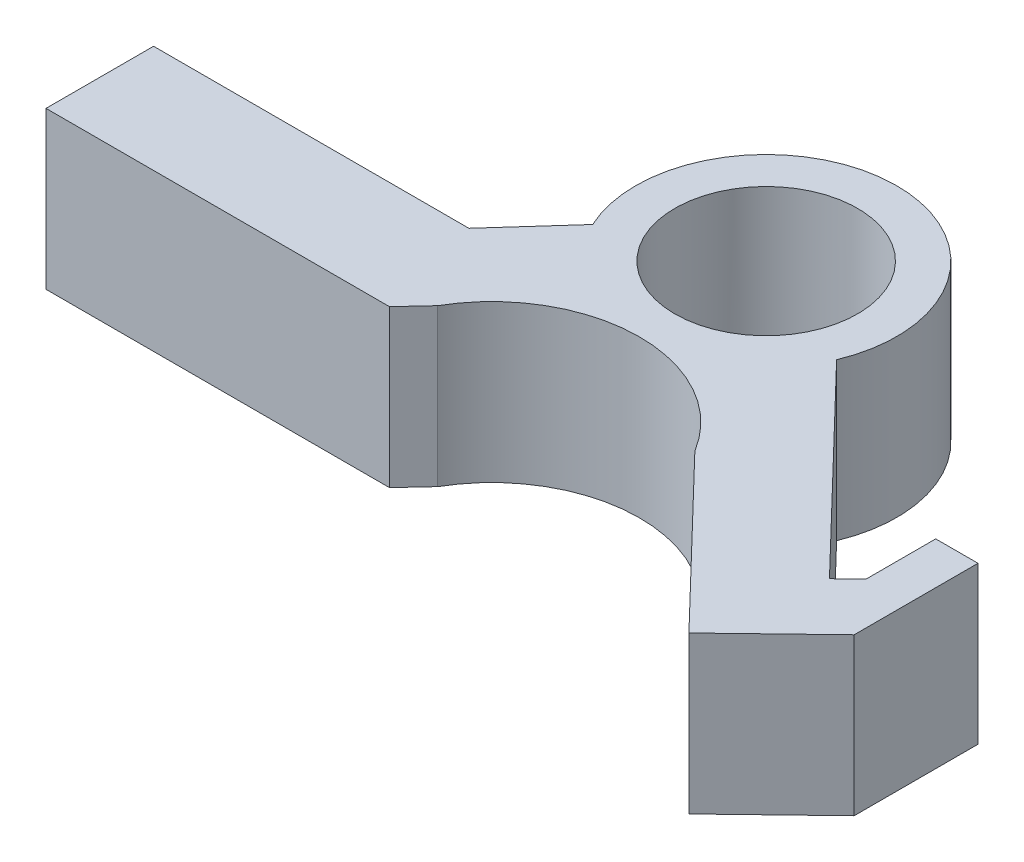
ISO-10303-21;
HEADER;
FILE_DESCRIPTION(('STEP AP214'),'2;1');
FILE_NAME('part.step','',(''),(''),'','','');
FILE_SCHEMA(('AUTOMOTIVE_DESIGN { 1 0 10303 214 1 1 1 1 }'));
ENDSEC;
DATA;
#1=APPLICATION_CONTEXT('core data for automotive mechanical design processes');
#2=APPLICATION_PROTOCOL_DEFINITION('international standard','automotive_design',2000,#1);
#3=PRODUCT_CONTEXT('',#1,'mechanical');
#4=PRODUCT('Part','Part','',(#3));
#5=PRODUCT_RELATED_PRODUCT_CATEGORY('part','',(#4));
#6=PRODUCT_DEFINITION_FORMATION('','',#4);
#7=PRODUCT_DEFINITION_CONTEXT('part definition',#1,'design');
#8=PRODUCT_DEFINITION('design','',#6,#7);
#9=PRODUCT_DEFINITION_SHAPE('','',#8);
#10=(LENGTH_UNIT() NAMED_UNIT(*) SI_UNIT(.MILLI.,.METRE.));
#11=(NAMED_UNIT(*) PLANE_ANGLE_UNIT() SI_UNIT($,.RADIAN.));
#12=(NAMED_UNIT(*) SI_UNIT($,.STERADIAN.) SOLID_ANGLE_UNIT());
#13=UNCERTAINTY_MEASURE_WITH_UNIT(LENGTH_MEASURE(1.E-05),#10,'distance_accuracy_value','');
#14=(GEOMETRIC_REPRESENTATION_CONTEXT(3) GLOBAL_UNCERTAINTY_ASSIGNED_CONTEXT((#13)) GLOBAL_UNIT_ASSIGNED_CONTEXT((#10,
#11,#12)) REPRESENTATION_CONTEXT('',''));
#15=CARTESIAN_POINT('',(0.,0.,0.));
#16=DIRECTION('',(0.,0.,1.));
#17=DIRECTION('',(1.,0.,0.));
#18=AXIS2_PLACEMENT_3D('',#15,#16,#17);
#19=CARTESIAN_POINT('',(-4.73105492739701,3.,-4.98136411508577));
#20=DIRECTION('',(1.,0.,0.));
#21=DIRECTION('',(0.,0.,-1.));
#22=AXIS2_PLACEMENT_3D('',#19,#20,#21);
#23=PLANE('',#22);
#24=DIRECTION('',(0.,0.,1.));
#25=VECTOR('',#24,1.);
#26=CARTESIAN_POINT('',(-4.73105492739701,0.,-4.98136411508577));
#27=LINE('',#26,#25);
#28=CARTESIAN_POINT('',(-4.73105492739701,0.,-4.98136411508577));
#29=VERTEX_POINT('',#28);
#30=CARTESIAN_POINT('',(-4.73105492739701,0.,-2.92221925829186));
#31=VERTEX_POINT('',#30);
#32=EDGE_CURVE('E177',#29,#31,#27,.T.);
#33=ORIENTED_EDGE('',*,*,#32,.T.);
#34=DIRECTION('',(0.,-1.,0.));
#35=VECTOR('',#34,1.);
#36=CARTESIAN_POINT('',(-4.73105492739701,3.,-2.92221925829186));
#37=LINE('',#36,#35);
#38=CARTESIAN_POINT('',(-4.73105492739701,3.,-2.92221925829186));
#39=VERTEX_POINT('',#38);
#40=EDGE_CURVE('E11',#39,#31,#37,.T.);
#41=ORIENTED_EDGE('',*,*,#40,.F.);
#42=DIRECTION('',(0.,0.,1.));
#43=VECTOR('',#42,1.);
#44=CARTESIAN_POINT('',(-4.73105492739701,3.,-4.98136411508577));
#45=LINE('',#44,#43);
#46=CARTESIAN_POINT('',(-4.73105492739701,3.,-4.98136411508577));
#47=VERTEX_POINT('',#46);
#48=EDGE_CURVE('E218',#47,#39,#45,.T.);
#49=ORIENTED_EDGE('',*,*,#48,.F.);
#50=DIRECTION('',(0.,-1.,0.));
#51=VECTOR('',#50,1.);
#52=CARTESIAN_POINT('',(-4.73105492739701,3.,-4.98136411508577));
#53=LINE('',#52,#51);
#54=EDGE_CURVE('E173',#47,#29,#53,.T.);
#55=ORIENTED_EDGE('',*,*,#54,.T.);
#56=EDGE_LOOP('',(#33,#41,#49,#55));
#57=FACE_BOUND('',#56,.T.);
#58=ADVANCED_FACE('F39',(#57),#23,.F.);
#59=CARTESIAN_POINT('',(-0.547473895030737,3.,-2.92221925829186));
#60=DIRECTION('',(0.,0.,-1.));
#61=DIRECTION('',(-1.,0.,0.));
#62=AXIS2_PLACEMENT_3D('',#59,#60,#61);
#63=PLANE('',#62);
#64=DIRECTION('',(1.,0.,0.));
#65=VECTOR('',#64,1.);
#66=CARTESIAN_POINT('',(-0.547473895030737,0.,-2.92221925829186));
#67=LINE('',#66,#65);
#68=CARTESIAN_POINT('',(1.84270236624225,0.,-2.92221925829186));
#69=VERTEX_POINT('',#68);
#70=EDGE_CURVE('E181',#31,#69,#67,.T.);
#71=ORIENTED_EDGE('',*,*,#70,.T.);
#72=DIRECTION('',(0.,-1.,0.));
#73=VECTOR('',#72,1.);
#74=CARTESIAN_POINT('',(1.84270236624225,3.,-2.92221925829186));
#75=LINE('',#74,#73);
#76=CARTESIAN_POINT('',(1.84270236624225,3.,-2.92221925829186));
#77=VERTEX_POINT('',#76);
#78=EDGE_CURVE('E49',#77,#69,#75,.T.);
#79=ORIENTED_EDGE('',*,*,#78,.F.);
#80=DIRECTION('',(1.,0.,0.));
#81=VECTOR('',#80,1.);
#82=CARTESIAN_POINT('',(-4.73105492739701,3.,-2.92221925829186));
#83=LINE('',#82,#81);
#84=EDGE_CURVE('E118',#39,#77,#83,.T.);
#85=ORIENTED_EDGE('',*,*,#84,.F.);
#86=ORIENTED_EDGE('',*,*,#40,.T.);
#87=EDGE_LOOP('',(#71,#79,#85,#86));
#88=FACE_BOUND('',#87,.T.);
#89=ADVANCED_FACE('F328',(#88),#63,.F.);
#90=CARTESIAN_POINT('',(2.28723864481899,3.,-3.40021678868414));
#91=DIRECTION('',(-0.732272746563109,0.,-0.681011471739588));
#92=DIRECTION('',(-0.681011471739588,0.,0.732272746563109));
#93=AXIS2_PLACEMENT_3D('',#90,#91,#92);
#94=PLANE('',#93);
#95=DIRECTION('',(0.681011471739588,0.,-0.732272746563109));
#96=VECTOR('',#95,1.);
#97=CARTESIAN_POINT('',(2.28723864481899,0.,-3.40021678868414));
#98=LINE('',#97,#96);
#99=CARTESIAN_POINT('',(2.28723864481899,0.,-3.40021678868414));
#100=VERTEX_POINT('',#99);
#101=EDGE_CURVE('E184',#69,#100,#98,.T.);
#102=ORIENTED_EDGE('',*,*,#101,.T.);
#103=DIRECTION('',(0.,-1.,0.));
#104=VECTOR('',#103,1.);
#105=CARTESIAN_POINT('',(2.28723864481899,3.,-3.40021678868414));
#106=LINE('',#105,#104);
#107=CARTESIAN_POINT('',(2.28723864481899,3.,-3.40021678868414));
#108=VERTEX_POINT('',#107);
#109=EDGE_CURVE('E253',#108,#100,#106,.T.);
#110=ORIENTED_EDGE('',*,*,#109,.F.);
#111=DIRECTION('',(0.681011471739588,0.,-0.732272746563109));
#112=VECTOR('',#111,1.);
#113=CARTESIAN_POINT('',(2.28723864481899,3.,-3.40021678868414));
#114=LINE('',#113,#112);
#115=EDGE_CURVE('E264',#77,#108,#114,.T.);
#116=ORIENTED_EDGE('',*,*,#115,.F.);
#117=ORIENTED_EDGE('',*,*,#78,.T.);
#118=EDGE_LOOP('',(#102,#110,#116,#117));
#119=FACE_BOUND('',#118,.T.);
#120=ADVANCED_FACE('F262',(#119),#94,.F.);
#121=CARTESIAN_POINT('',(4.73788184300133,3.,-1.98466372107976));
#122=DIRECTION('',(0.,-1.,0.));
#123=DIRECTION('',(0.,0.,-1.));
#124=AXIS2_PLACEMENT_3D('',#121,#122,#123);
#125=CYLINDRICAL_SURFACE('',#124,2.83009585915416);
#126=CARTESIAN_POINT('',(4.73788184300133,0.,-1.98466372107976));
#127=DIRECTION('',(0.,-1.,0.));
#128=DIRECTION('',(0.,0.,-1.));
#129=AXIS2_PLACEMENT_3D('',#126,#127,#128);
#130=CIRCLE('',#129,2.83009585915416);
#131=CARTESIAN_POINT('',(7.15744834866283,0.,-3.45270339925013));
#132=VERTEX_POINT('',#131);
#133=EDGE_CURVE('E187',#100,#132,#130,.T.);
#134=ORIENTED_EDGE('',*,*,#133,.T.);
#135=DIRECTION('',(0.,-1.,0.));
#136=VECTOR('',#135,1.);
#137=CARTESIAN_POINT('',(7.15744834866283,3.,-3.45270339925013));
#138=LINE('',#137,#136);
#139=CARTESIAN_POINT('',(7.15744834866283,3.,-3.45270339925013));
#140=VERTEX_POINT('',#139);
#141=EDGE_CURVE('E249',#140,#132,#138,.T.);
#142=ORIENTED_EDGE('',*,*,#141,.F.);
#143=CARTESIAN_POINT('',(4.73788184300133,3.,-1.98466372107976));
#144=DIRECTION('',(0.,-1.,0.));
#145=DIRECTION('',(0.,0.,-1.));
#146=AXIS2_PLACEMENT_3D('',#143,#144,#145);
#147=CIRCLE('',#146,2.83009585915416);
#148=EDGE_CURVE('E283',#108,#140,#147,.T.);
#149=ORIENTED_EDGE('',*,*,#148,.F.);
#150=ORIENTED_EDGE('',*,*,#109,.T.);
#151=EDGE_LOOP('',(#134,#142,#149,#150));
#152=FACE_BOUND('',#151,.T.);
#153=ADVANCED_FACE('F273',(#152),#125,.F.);
#154=CARTESIAN_POINT('',(10.1172225774552,3.,-0.379091700119534));
#155=DIRECTION('',(0.720320213491482,0.,-0.69364168706587));
#156=DIRECTION('',(-0.69364168706587,0.,-0.720320213491482));
#157=AXIS2_PLACEMENT_3D('',#154,#155,#156);
#158=PLANE('',#157);
#159=DIRECTION('',(0.69364168706587,0.,0.720320213491482));
#160=VECTOR('',#159,1.);
#161=CARTESIAN_POINT('',(10.1172225774552,0.,-0.379091700119534));
#162=LINE('',#161,#160);
#163=CARTESIAN_POINT('',(10.1172225774552,0.,-0.379091700119534));
#164=VERTEX_POINT('',#163);
#165=EDGE_CURVE('E190',#132,#164,#162,.T.);
#166=ORIENTED_EDGE('',*,*,#165,.T.);
#167=DIRECTION('',(0.,-1.,0.));
#168=VECTOR('',#167,1.);
#169=CARTESIAN_POINT('',(10.1172225774552,3.,-0.379091700119534));
#170=LINE('',#169,#168);
#171=CARTESIAN_POINT('',(10.1172225774552,3.,-0.379091700119534));
#172=VERTEX_POINT('',#171);
#173=EDGE_CURVE('E245',#172,#164,#170,.T.);
#174=ORIENTED_EDGE('',*,*,#173,.F.);
#175=DIRECTION('',(0.69364168706587,0.,0.720320213491482));
#176=VECTOR('',#175,1.);
#177=CARTESIAN_POINT('',(10.1172225774552,3.,-0.379091700119534));
#178=LINE('',#177,#176);
#179=EDGE_CURVE('E279',#140,#172,#178,.T.);
#180=ORIENTED_EDGE('',*,*,#179,.F.);
#181=ORIENTED_EDGE('',*,*,#141,.T.);
#182=EDGE_LOOP('',(#166,#174,#180,#181));
#183=FACE_BOUND('',#182,.T.);
#184=ADVANCED_FACE('F277',(#183),#158,.F.);
#185=CARTESIAN_POINT('',(11.7286495144338,3.,-1.9308361579507));
#186=DIRECTION('',(-0.69364168706587,0.,-0.720320213491481));
#187=DIRECTION('',(-0.720320213491481,0.,0.69364168706587));
#188=AXIS2_PLACEMENT_3D('',#185,#186,#187);
#189=PLANE('',#188);
#190=DIRECTION('',(0.720320213491481,0.,-0.69364168706587));
#191=VECTOR('',#190,1.);
#192=CARTESIAN_POINT('',(11.7286495144338,0.,-1.9308361579507));
#193=LINE('',#192,#191);
#194=CARTESIAN_POINT('',(11.7286495144338,0.,-1.9308361579507));
#195=VERTEX_POINT('',#194);
#196=EDGE_CURVE('E193',#164,#195,#193,.T.);
#197=ORIENTED_EDGE('',*,*,#196,.T.);
#198=DIRECTION('',(0.,-1.,0.));
#199=VECTOR('',#198,1.);
#200=CARTESIAN_POINT('',(11.7286495144338,3.,-1.9308361579507));
#201=LINE('',#200,#199);
#202=CARTESIAN_POINT('',(11.7286495144338,3.,-1.9308361579507));
#203=VERTEX_POINT('',#202);
#204=EDGE_CURVE('E241',#203,#195,#201,.T.);
#205=ORIENTED_EDGE('',*,*,#204,.F.);
#206=DIRECTION('',(0.720320213491481,0.,-0.69364168706587));
#207=VECTOR('',#206,1.);
#208=CARTESIAN_POINT('',(11.7286495144338,3.,-1.9308361579507));
#209=LINE('',#208,#207);
#210=EDGE_CURVE('E282',#172,#203,#209,.T.);
#211=ORIENTED_EDGE('',*,*,#210,.F.);
#212=ORIENTED_EDGE('',*,*,#173,.T.);
#213=EDGE_LOOP('',(#197,#205,#211,#212));
#214=FACE_BOUND('',#213,.T.);
#215=ADVANCED_FACE('F341',(#214),#189,.F.);
#216=CARTESIAN_POINT('',(11.7286495144338,3.,-3.25273950336832));
#217=DIRECTION('',(-1.,0.,0.));
#218=DIRECTION('',(0.,0.,1.));
#219=AXIS2_PLACEMENT_3D('',#216,#217,#218);
#220=PLANE('',#219);
#221=DIRECTION('',(0.,0.,-1.));
#222=VECTOR('',#221,1.);
#223=CARTESIAN_POINT('',(11.7286495144338,0.,-3.25273950336832));
#224=LINE('',#223,#222);
#225=CARTESIAN_POINT('',(11.7286495144338,0.,-4.3007599274166));
#226=VERTEX_POINT('',#225);
#227=EDGE_CURVE('E197',#195,#226,#224,.T.);
#228=ORIENTED_EDGE('',*,*,#227,.T.);
#229=DIRECTION('',(0.,-1.,0.));
#230=VECTOR('',#229,1.);
#231=CARTESIAN_POINT('',(11.7286495144338,3.,-4.3007599274166));
#232=LINE('',#231,#230);
#233=CARTESIAN_POINT('',(11.7286495144338,3.,-4.3007599274166));
#234=VERTEX_POINT('',#233);
#235=EDGE_CURVE('E237',#234,#226,#232,.T.);
#236=ORIENTED_EDGE('',*,*,#235,.F.);
#237=DIRECTION('',(0.,0.,-1.));
#238=VECTOR('',#237,1.);
#239=CARTESIAN_POINT('',(11.7286495144338,3.,-3.25273950336832));
#240=LINE('',#239,#238);
#241=EDGE_CURVE('E287',#203,#234,#240,.T.);
#242=ORIENTED_EDGE('',*,*,#241,.F.);
#243=ORIENTED_EDGE('',*,*,#204,.T.);
#244=EDGE_LOOP('',(#228,#236,#242,#243));
#245=FACE_BOUND('',#244,.T.);
#246=ADVANCED_FACE('F344',(#245),#220,.F.);
#247=CARTESIAN_POINT('',(11.7286495144338,3.,-4.3007599274166));
#248=DIRECTION('',(0.,0.,1.));
#249=DIRECTION('',(1.,0.,0.));
#250=AXIS2_PLACEMENT_3D('',#247,#248,#249);
#251=PLANE('',#250);
#252=DIRECTION('',(-1.,0.,0.));
#253=VECTOR('',#252,1.);
#254=CARTESIAN_POINT('',(11.7286495144338,0.,-4.3007599274166));
#255=LINE('',#254,#253);
#256=CARTESIAN_POINT('',(10.919592499106,0.,-4.3007599274166));
#257=VERTEX_POINT('',#256);
#258=EDGE_CURVE('E200',#226,#257,#255,.T.);
#259=ORIENTED_EDGE('',*,*,#258,.T.);
#260=DIRECTION('',(0.,-1.,0.));
#261=VECTOR('',#260,1.);
#262=CARTESIAN_POINT('',(10.919592499106,3.,-4.3007599274166));
#263=LINE('',#262,#261);
#264=CARTESIAN_POINT('',(10.919592499106,3.,-4.3007599274166));
#265=VERTEX_POINT('',#264);
#266=EDGE_CURVE('E233',#265,#257,#263,.T.);
#267=ORIENTED_EDGE('',*,*,#266,.F.);
#268=DIRECTION('',(-1.,0.,0.));
#269=VECTOR('',#268,1.);
#270=CARTESIAN_POINT('',(11.7286495144338,3.,-4.3007599274166));
#271=LINE('',#270,#269);
#272=EDGE_CURVE('E294',#234,#265,#271,.T.);
#273=ORIENTED_EDGE('',*,*,#272,.F.);
#274=ORIENTED_EDGE('',*,*,#235,.T.);
#275=EDGE_LOOP('',(#259,#267,#273,#274));
#276=FACE_BOUND('',#275,.T.);
#277=ADVANCED_FACE('F348',(#276),#251,.F.);
#278=CARTESIAN_POINT('',(10.919592499106,3.,-4.3007599274166));
#279=DIRECTION('',(1.,0.,0.));
#280=DIRECTION('',(0.,0.,-1.));
#281=AXIS2_PLACEMENT_3D('',#278,#279,#280);
#282=PLANE('',#281);
#283=DIRECTION('',(0.,0.,1.));
#284=VECTOR('',#283,1.);
#285=CARTESIAN_POINT('',(10.919592499106,0.,-4.3007599274166));
#286=LINE('',#285,#284);
#287=CARTESIAN_POINT('',(10.919592499106,0.,-2.96724024901935));
#288=VERTEX_POINT('',#287);
#289=EDGE_CURVE('E203',#257,#288,#286,.T.);
#290=ORIENTED_EDGE('',*,*,#289,.T.);
#291=DIRECTION('',(0.,-1.,0.));
#292=VECTOR('',#291,1.);
#293=CARTESIAN_POINT('',(10.919592499106,3.,-2.96724024901935));
#294=LINE('',#293,#292);
#295=CARTESIAN_POINT('',(10.919592499106,3.,-2.96724024901935));
#296=VERTEX_POINT('',#295);
#297=EDGE_CURVE('E229',#296,#288,#294,.T.);
#298=ORIENTED_EDGE('',*,*,#297,.F.);
#299=DIRECTION('',(0.,0.,1.));
#300=VECTOR('',#299,1.);
#301=CARTESIAN_POINT('',(10.919592499106,3.,-4.3007599274166));
#302=LINE('',#301,#300);
#303=EDGE_CURVE('E297',#265,#296,#302,.T.);
#304=ORIENTED_EDGE('',*,*,#303,.F.);
#305=ORIENTED_EDGE('',*,*,#266,.T.);
#306=EDGE_LOOP('',(#290,#298,#304,#305));
#307=FACE_BOUND('',#306,.T.);
#308=ADVANCED_FACE('F352',(#307),#282,.F.);
#309=CARTESIAN_POINT('',(10.5626161408651,3.,-2.62348523737996));
#310=DIRECTION('',(0.693641687065871,0.,0.72032021349148));
#311=DIRECTION('',(0.72032021349148,0.,-0.693641687065871));
#312=AXIS2_PLACEMENT_3D('',#309,#310,#311);
#313=PLANE('',#312);
#314=DIRECTION('',(-0.72032021349148,0.,0.693641687065871));
#315=VECTOR('',#314,1.);
#316=CARTESIAN_POINT('',(10.5626161408651,0.,-2.62348523737996));
#317=LINE('',#316,#315);
#318=CARTESIAN_POINT('',(10.5626161408651,0.,-2.62348523737996));
#319=VERTEX_POINT('',#318);
#320=EDGE_CURVE('E206',#288,#319,#317,.T.);
#321=ORIENTED_EDGE('',*,*,#320,.T.);
#322=DIRECTION('',(0.,-1.,0.));
#323=VECTOR('',#322,1.);
#324=CARTESIAN_POINT('',(10.5626161408651,3.,-2.62348523737996));
#325=LINE('',#324,#323);
#326=CARTESIAN_POINT('',(10.5626161408651,3.,-2.62348523737996));
#327=VERTEX_POINT('',#326);
#328=EDGE_CURVE('E225',#327,#319,#325,.T.);
#329=ORIENTED_EDGE('',*,*,#328,.F.);
#330=DIRECTION('',(-0.72032021349148,0.,0.693641687065871));
#331=VECTOR('',#330,1.);
#332=CARTESIAN_POINT('',(10.5626161408651,3.,-2.62348523737996));
#333=LINE('',#332,#331);
#334=EDGE_CURVE('E300',#296,#327,#333,.T.);
#335=ORIENTED_EDGE('',*,*,#334,.F.);
#336=ORIENTED_EDGE('',*,*,#297,.T.);
#337=EDGE_LOOP('',(#321,#329,#335,#336));
#338=FACE_BOUND('',#337,.T.);
#339=ADVANCED_FACE('F308',(#338),#313,.F.);
#340=CARTESIAN_POINT('',(7.00137007605124,3.,-6.32170230468664));
#341=DIRECTION('',(-0.72032021349148,0.,0.693641687065871));
#342=DIRECTION('',(0.693641687065871,0.,0.72032021349148));
#343=AXIS2_PLACEMENT_3D('',#340,#341,#342);
#344=PLANE('',#343);
#345=DIRECTION('',(-0.693641687065871,0.,-0.72032021349148));
#346=VECTOR('',#345,1.);
#347=CARTESIAN_POINT('',(7.00137007605124,0.,-6.32170230468664));
#348=LINE('',#347,#346);
#349=CARTESIAN_POINT('',(7.00137007605124,0.,-6.32170230468664));
#350=VERTEX_POINT('',#349);
#351=EDGE_CURVE('E209',#319,#350,#348,.T.);
#352=ORIENTED_EDGE('',*,*,#351,.T.);
#353=DIRECTION('',(0.,-1.,0.));
#354=VECTOR('',#353,1.);
#355=CARTESIAN_POINT('',(7.00137007605124,3.,-6.32170230468664));
#356=LINE('',#355,#354);
#357=CARTESIAN_POINT('',(7.00137007605124,3.,-6.32170230468664));
#358=VERTEX_POINT('',#357);
#359=EDGE_CURVE('E166',#358,#350,#356,.T.);
#360=ORIENTED_EDGE('',*,*,#359,.F.);
#361=DIRECTION('',(-0.693641687065871,0.,-0.72032021349148));
#362=VECTOR('',#361,1.);
#363=CARTESIAN_POINT('',(7.00137007605124,3.,-6.32170230468664));
#364=LINE('',#363,#362);
#365=EDGE_CURVE('E155',#327,#358,#364,.T.);
#366=ORIENTED_EDGE('',*,*,#365,.F.);
#367=ORIENTED_EDGE('',*,*,#328,.T.);
#368=EDGE_LOOP('',(#352,#360,#366,#367));
#369=FACE_BOUND('',#368,.T.);
#370=ADVANCED_FACE('F312',(#369),#344,.F.);
#371=CARTESIAN_POINT('',(4.69323825516391,3.,-7.28218525477337));
#372=DIRECTION('',(0.,-1.,0.));
#373=DIRECTION('',(0.,0.,-1.));
#374=AXIS2_PLACEMENT_3D('',#371,#372,#373);
#375=CYLINDRICAL_SURFACE('',#374,2.5);
#376=CARTESIAN_POINT('',(4.69323825516391,0.,-7.28218525477337));
#377=DIRECTION('',(0.,1.,0.));
#378=DIRECTION('',(0.,0.,1.));
#379=AXIS2_PLACEMENT_3D('',#376,#377,#378);
#380=CIRCLE('',#379,2.5);
#381=CARTESIAN_POINT('',(2.42580487304512,0.,-6.22921523732112));
#382=VERTEX_POINT('',#381);
#383=EDGE_CURVE('E164',#350,#382,#380,.T.);
#384=ORIENTED_EDGE('',*,*,#383,.T.);
#385=DIRECTION('',(0.,-1.,0.));
#386=VECTOR('',#385,1.);
#387=CARTESIAN_POINT('',(2.42580487304512,3.,-6.22921523732112));
#388=LINE('',#387,#386);
#389=CARTESIAN_POINT('',(2.42580487304512,3.,-6.22921523732112));
#390=VERTEX_POINT('',#389);
#391=EDGE_CURVE('E161',#390,#382,#388,.T.);
#392=ORIENTED_EDGE('',*,*,#391,.F.);
#393=CARTESIAN_POINT('',(4.69323825516391,3.,-7.28218525477337));
#394=DIRECTION('',(0.,1.,0.));
#395=DIRECTION('',(0.,0.,1.));
#396=AXIS2_PLACEMENT_3D('',#393,#394,#395);
#397=CIRCLE('',#396,2.5);
#398=EDGE_CURVE('E149',#358,#390,#397,.T.);
#399=ORIENTED_EDGE('',*,*,#398,.F.);
#400=ORIENTED_EDGE('',*,*,#359,.T.);
#401=EDGE_LOOP('',(#384,#392,#399,#400));
#402=FACE_BOUND('',#401,.T.);
#403=ADVANCED_FACE('F162',(#402),#375,.T.);
#404=CARTESIAN_POINT('',(1.30387751934114,3.,-4.98136411508577));
#405=DIRECTION('',(0.743631456747864,0.,0.668589752041601));
#406=DIRECTION('',(0.668589752041601,0.,-0.743631456747864));
#407=AXIS2_PLACEMENT_3D('',#404,#405,#406);
#408=PLANE('',#407);
#409=DIRECTION('',(-0.668589752041601,0.,0.743631456747864));
#410=VECTOR('',#409,1.);
#411=CARTESIAN_POINT('',(1.30387751934114,0.,-4.98136411508577));
#412=LINE('',#411,#410);
#413=CARTESIAN_POINT('',(1.30387751934114,0.,-4.98136411508577));
#414=VERTEX_POINT('',#413);
#415=EDGE_CURVE('E104',#382,#414,#412,.T.);
#416=ORIENTED_EDGE('',*,*,#415,.T.);
#417=DIRECTION('',(0.,-1.,0.));
#418=VECTOR('',#417,1.);
#419=CARTESIAN_POINT('',(1.30387751934114,3.,-4.98136411508577));
#420=LINE('',#419,#418);
#421=CARTESIAN_POINT('',(1.30387751934114,3.,-4.98136411508577));
#422=VERTEX_POINT('',#421);
#423=EDGE_CURVE('E167',#422,#414,#420,.T.);
#424=ORIENTED_EDGE('',*,*,#423,.F.);
#425=DIRECTION('',(-0.668589752041601,0.,0.743631456747864));
#426=VECTOR('',#425,1.);
#427=CARTESIAN_POINT('',(1.30387751934114,3.,-4.98136411508577));
#428=LINE('',#427,#426);
#429=EDGE_CURVE('E153',#390,#422,#428,.T.);
#430=ORIENTED_EDGE('',*,*,#429,.F.);
#431=ORIENTED_EDGE('',*,*,#391,.T.);
#432=EDGE_LOOP('',(#416,#424,#430,#431));
#433=FACE_BOUND('',#432,.T.);
#434=ADVANCED_FACE('F169',(#433),#408,.F.);
#435=CARTESIAN_POINT('',(-4.73105492739701,3.,-4.98136411508577));
#436=DIRECTION('',(0.,0.,1.));
#437=DIRECTION('',(1.,0.,0.));
#438=AXIS2_PLACEMENT_3D('',#435,#436,#437);
#439=PLANE('',#438);
#440=DIRECTION('',(-1.,0.,0.));
#441=VECTOR('',#440,1.);
#442=CARTESIAN_POINT('',(-4.73105492739701,0.,-4.98136411508577));
#443=LINE('',#442,#441);
#444=EDGE_CURVE('E110',#414,#29,#443,.T.);
#445=ORIENTED_EDGE('',*,*,#444,.T.);
#446=ORIENTED_EDGE('',*,*,#54,.F.);
#447=DIRECTION('',(-1.,0.,0.));
#448=VECTOR('',#447,1.);
#449=CARTESIAN_POINT('',(-4.73105492739701,3.,-4.98136411508577));
#450=LINE('',#449,#448);
#451=EDGE_CURVE('E57',#422,#47,#450,.T.);
#452=ORIENTED_EDGE('',*,*,#451,.F.);
#453=ORIENTED_EDGE('',*,*,#423,.T.);
#454=EDGE_LOOP('',(#445,#446,#452,#453));
#455=FACE_BOUND('',#454,.T.);
#456=ADVANCED_FACE('F316',(#455),#439,.F.);
#457=CARTESIAN_POINT('',(4.73788184300133,3.,-1.98466372107976));
#458=DIRECTION('',(0.,-1.,0.));
#459=DIRECTION('',(0.,0.,-1.));
#460=AXIS2_PLACEMENT_3D('',#457,#458,#459);
#461=PLANE('',#460);
#462=CARTESIAN_POINT('',(4.69323825516391,3.,-7.28218525477337));
#463=DIRECTION('',(0.,1.,0.));
#464=DIRECTION('',(0.,0.,1.));
#465=AXIS2_PLACEMENT_3D('',#462,#463,#464);
#466=CIRCLE('',#465,1.75);
#467=CARTESIAN_POINT('',(4.69323825516391,3.,-5.53218525477337));
#468=VERTEX_POINT('',#467);
#469=EDGE_CURVE('E407',#468,#468,#466,.T.);
#470=ORIENTED_EDGE('',*,*,#469,.F.);
#471=EDGE_LOOP('',(#470));
#472=FACE_BOUND('',#471,.T.);
#473=ORIENTED_EDGE('',*,*,#48,.T.);
#474=ORIENTED_EDGE('',*,*,#84,.T.);
#475=ORIENTED_EDGE('',*,*,#115,.T.);
#476=ORIENTED_EDGE('',*,*,#148,.T.);
#477=ORIENTED_EDGE('',*,*,#179,.T.);
#478=ORIENTED_EDGE('',*,*,#210,.T.);
#479=ORIENTED_EDGE('',*,*,#241,.T.);
#480=ORIENTED_EDGE('',*,*,#272,.T.);
#481=ORIENTED_EDGE('',*,*,#303,.T.);
#482=ORIENTED_EDGE('',*,*,#334,.T.);
#483=ORIENTED_EDGE('',*,*,#365,.T.);
#484=ORIENTED_EDGE('',*,*,#398,.T.);
#485=ORIENTED_EDGE('',*,*,#429,.T.);
#486=ORIENTED_EDGE('',*,*,#451,.T.);
#487=EDGE_LOOP('',(#473,#474,#475,#476,#477,#478,#479,#480,#481,#482,#483,#484,#485,#486));
#488=FACE_BOUND('',#487,.T.);
#489=ADVANCED_FACE('F151',(#472,#488),#461,.F.);
#490=CARTESIAN_POINT('',(4.73788184300133,0.,-1.98466372107976));
#491=DIRECTION('',(0.,-1.,0.));
#492=DIRECTION('',(0.,0.,-1.));
#493=AXIS2_PLACEMENT_3D('',#490,#491,#492);
#494=PLANE('',#493);
#495=CARTESIAN_POINT('',(4.69323825516391,0.,-7.28218525477337));
#496=DIRECTION('',(0.,-1.,0.));
#497=DIRECTION('',(0.,0.,-1.));
#498=AXIS2_PLACEMENT_3D('',#495,#496,#497);
#499=CIRCLE('',#498,1.75);
#500=CARTESIAN_POINT('',(4.69323825516391,0.,-9.03218525477337));
#501=VERTEX_POINT('',#500);
#502=EDGE_CURVE('E42',#501,#501,#499,.T.);
#503=ORIENTED_EDGE('',*,*,#502,.F.);
#504=EDGE_LOOP('',(#503));
#505=FACE_BOUND('',#504,.T.);
#506=ORIENTED_EDGE('',*,*,#32,.F.);
#507=ORIENTED_EDGE('',*,*,#444,.F.);
#508=ORIENTED_EDGE('',*,*,#415,.F.);
#509=ORIENTED_EDGE('',*,*,#383,.F.);
#510=ORIENTED_EDGE('',*,*,#351,.F.);
#511=ORIENTED_EDGE('',*,*,#320,.F.);
#512=ORIENTED_EDGE('',*,*,#289,.F.);
#513=ORIENTED_EDGE('',*,*,#258,.F.);
#514=ORIENTED_EDGE('',*,*,#227,.F.);
#515=ORIENTED_EDGE('',*,*,#196,.F.);
#516=ORIENTED_EDGE('',*,*,#165,.F.);
#517=ORIENTED_EDGE('',*,*,#133,.F.);
#518=ORIENTED_EDGE('',*,*,#101,.F.);
#519=ORIENTED_EDGE('',*,*,#70,.F.);
#520=EDGE_LOOP('',(#506,#507,#508,#509,#510,#511,#512,#513,#514,#515,#516,#517,#518,#519));
#521=FACE_BOUND('',#520,.T.);
#522=ADVANCED_FACE('F268',(#505,#521),#494,.T.);
#523=CARTESIAN_POINT('',(4.69323825516391,-7.,-7.28218525477337));
#524=DIRECTION('',(0.,1.,0.));
#525=DIRECTION('',(0.,0.,1.));
#526=AXIS2_PLACEMENT_3D('',#523,#524,#525);
#527=CYLINDRICAL_SURFACE('',#526,1.75);
#528=ORIENTED_EDGE('',*,*,#502,.T.);
#529=EDGE_LOOP('',(#528));
#530=FACE_BOUND('',#529,.T.);
#531=ORIENTED_EDGE('',*,*,#469,.T.);
#532=EDGE_LOOP('',(#531));
#533=FACE_BOUND('',#532,.T.);
#534=ADVANCED_FACE('F389',(#530,#533),#527,.F.);
#535=CLOSED_SHELL('',(#58,#89,#120,#153,#184,#215,#246,#277,#308,#339,#370,#403,#434,#456,#489,
#522,#534));
#536=MANIFOLD_SOLID_BREP('B2',#535);
#537=ADVANCED_BREP_SHAPE_REPRESENTATION('',(#18,#536),#14);
#538=SHAPE_DEFINITION_REPRESENTATION(#9,#537);
ENDSEC;
END-ISO-10303-21;
